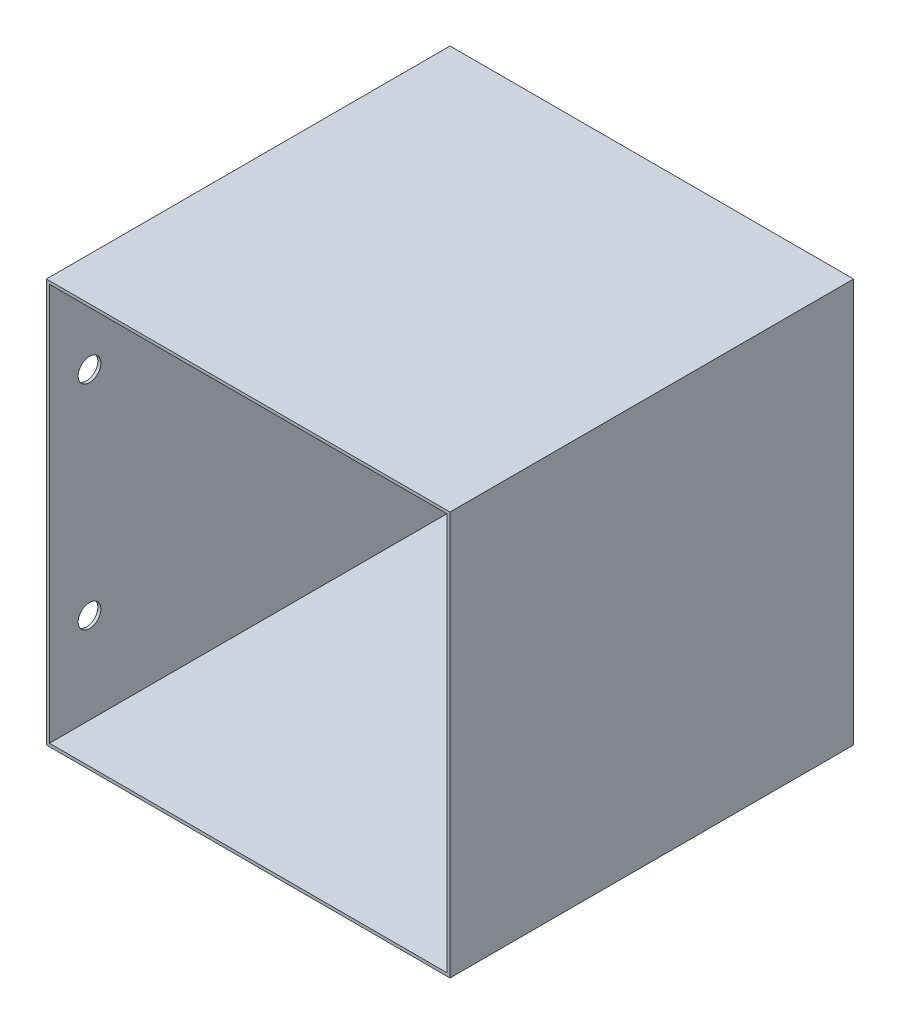
ISO-10303-21;
HEADER;
FILE_DESCRIPTION(('STEP AP214'),'2;1');
FILE_NAME('part.step','',(''),(''),'','','');
FILE_SCHEMA(('AUTOMOTIVE_DESIGN { 1 0 10303 214 1 1 1 1 }'));
ENDSEC;
DATA;
#1=APPLICATION_CONTEXT('core data for automotive mechanical design processes');
#2=APPLICATION_PROTOCOL_DEFINITION('international standard','automotive_design',2000,#1);
#3=PRODUCT_CONTEXT('',#1,'mechanical');
#4=PRODUCT('Part','Part','',(#3));
#5=PRODUCT_RELATED_PRODUCT_CATEGORY('part','',(#4));
#6=PRODUCT_DEFINITION_FORMATION('','',#4);
#7=PRODUCT_DEFINITION_CONTEXT('part definition',#1,'design');
#8=PRODUCT_DEFINITION('design','',#6,#7);
#9=PRODUCT_DEFINITION_SHAPE('','',#8);
#10=(LENGTH_UNIT() NAMED_UNIT(*) SI_UNIT(.MILLI.,.METRE.));
#11=(NAMED_UNIT(*) PLANE_ANGLE_UNIT() SI_UNIT($,.RADIAN.));
#12=(NAMED_UNIT(*) SI_UNIT($,.STERADIAN.) SOLID_ANGLE_UNIT());
#13=UNCERTAINTY_MEASURE_WITH_UNIT(LENGTH_MEASURE(1.E-05),#10,'distance_accuracy_value','');
#14=(GEOMETRIC_REPRESENTATION_CONTEXT(3) GLOBAL_UNCERTAINTY_ASSIGNED_CONTEXT((#13)) GLOBAL_UNIT_ASSIGNED_CONTEXT((#10,
#11,#12)) REPRESENTATION_CONTEXT('',''));
#15=CARTESIAN_POINT('',(0.,0.,0.));
#16=DIRECTION('',(0.,0.,1.));
#17=DIRECTION('',(1.,0.,0.));
#18=AXIS2_PLACEMENT_3D('',#15,#16,#17);
#19=CARTESIAN_POINT('',(0.,0.,80.));
#20=DIRECTION('',(1.,0.,0.));
#21=DIRECTION('',(0.,0.,-1.));
#22=AXIS2_PLACEMENT_3D('',#19,#20,#21);
#23=PLANE('',#22);
#24=CARTESIAN_POINT('',(0.,60.7922841895202,72.0624999999998));
#25=DIRECTION('',(-1.,0.,0.));
#26=DIRECTION('',(0.,0.,1.));
#27=AXIS2_PLACEMENT_3D('',#24,#25,#26);
#28=CIRCLE('',#27,2.24999999999999);
#29=CARTESIAN_POINT('',(0.,60.7922841895202,74.3124999999998));
#30=VERTEX_POINT('',#29);
#31=EDGE_CURVE('E197',#30,#30,#28,.T.);
#32=ORIENTED_EDGE('',*,*,#31,.F.);
#33=EDGE_LOOP('',(#32));
#34=FACE_BOUND('',#33,.T.);
#35=DIRECTION('',(0.,-1.,0.));
#36=VECTOR('',#35,1.);
#37=CARTESIAN_POINT('',(0.,0.,0.));
#38=LINE('',#37,#36);
#39=CARTESIAN_POINT('',(0.,80.,0.));
#40=VERTEX_POINT('',#39);
#41=CARTESIAN_POINT('',(0.,0.,0.));
#42=VERTEX_POINT('',#41);
#43=EDGE_CURVE('E144',#40,#42,#38,.T.);
#44=ORIENTED_EDGE('',*,*,#43,.T.);
#45=DIRECTION('',(0.,0.,-1.));
#46=VECTOR('',#45,1.);
#47=CARTESIAN_POINT('',(0.,0.,80.));
#48=LINE('',#47,#46);
#49=CARTESIAN_POINT('',(0.,0.,80.));
#50=VERTEX_POINT('',#49);
#51=EDGE_CURVE('E11',#50,#42,#48,.T.);
#52=ORIENTED_EDGE('',*,*,#51,.F.);
#53=DIRECTION('',(0.,-1.,0.));
#54=VECTOR('',#53,1.);
#55=CARTESIAN_POINT('',(0.,0.,80.));
#56=LINE('',#55,#54);
#57=CARTESIAN_POINT('',(0.,80.,80.));
#58=VERTEX_POINT('',#57);
#59=EDGE_CURVE('E133',#58,#50,#56,.T.);
#60=ORIENTED_EDGE('',*,*,#59,.F.);
#61=DIRECTION('',(0.,0.,-1.));
#62=VECTOR('',#61,1.);
#63=CARTESIAN_POINT('',(0.,80.,80.));
#64=LINE('',#63,#62);
#65=EDGE_CURVE('E143',#58,#40,#64,.T.);
#66=ORIENTED_EDGE('',*,*,#65,.T.);
#67=EDGE_LOOP('',(#44,#52,#60,#66));
#68=FACE_BOUND('',#67,.T.);
#69=CARTESIAN_POINT('',(0.,18.5518311382399,72.0624999999997));
#70=DIRECTION('',(-1.,0.,0.));
#71=DIRECTION('',(0.,0.,1.));
#72=AXIS2_PLACEMENT_3D('',#69,#70,#71);
#73=CIRCLE('',#72,2.24999999999999);
#74=CARTESIAN_POINT('',(0.,18.5518311382399,74.3124999999997));
#75=VERTEX_POINT('',#74);
#76=EDGE_CURVE('E203',#75,#75,#73,.T.);
#77=ORIENTED_EDGE('',*,*,#76,.F.);
#78=EDGE_LOOP('',(#77));
#79=FACE_BOUND('',#78,.T.);
#80=ADVANCED_FACE('F35',(#34,#68,#79),#23,.F.);
#81=CARTESIAN_POINT('',(0.,0.,80.));
#82=DIRECTION('',(0.,0.,-1.));
#83=DIRECTION('',(-1.,0.,0.));
#84=AXIS2_PLACEMENT_3D('',#81,#82,#83);
#85=PLANE('',#84);
#86=ORIENTED_EDGE('',*,*,#59,.T.);
#87=DIRECTION('',(1.,0.,0.));
#88=VECTOR('',#87,1.);
#89=CARTESIAN_POINT('',(0.,0.,80.));
#90=LINE('',#89,#88);
#91=CARTESIAN_POINT('',(80.,0.,80.));
#92=VERTEX_POINT('',#91);
#93=EDGE_CURVE('E136',#50,#92,#90,.T.);
#94=ORIENTED_EDGE('',*,*,#93,.T.);
#95=DIRECTION('',(0.,1.,0.));
#96=VECTOR('',#95,1.);
#97=CARTESIAN_POINT('',(80.,0.,80.));
#98=LINE('',#97,#96);
#99=CARTESIAN_POINT('',(80.,80.,80.));
#100=VERTEX_POINT('',#99);
#101=EDGE_CURVE('E139',#92,#100,#98,.T.);
#102=ORIENTED_EDGE('',*,*,#101,.T.);
#103=DIRECTION('',(-1.,0.,0.));
#104=VECTOR('',#103,1.);
#105=CARTESIAN_POINT('',(0.,80.,80.));
#106=LINE('',#105,#104);
#107=EDGE_CURVE('E141',#100,#58,#106,.T.);
#108=ORIENTED_EDGE('',*,*,#107,.T.);
#109=EDGE_LOOP('',(#86,#94,#102,#108));
#110=FACE_BOUND('',#109,.T.);
#111=DIRECTION('',(0.,-1.,0.));
#112=VECTOR('',#111,1.);
#113=CARTESIAN_POINT('',(0.6,0.,80.));
#114=LINE('',#113,#112);
#115=CARTESIAN_POINT('',(0.6,79.4,80.));
#116=VERTEX_POINT('',#115);
#117=CARTESIAN_POINT('',(0.6,0.6,80.));
#118=VERTEX_POINT('',#117);
#119=EDGE_CURVE('E121',#116,#118,#114,.T.);
#120=ORIENTED_EDGE('',*,*,#119,.F.);
#121=DIRECTION('',(-1.,0.,0.));
#122=VECTOR('',#121,1.);
#123=CARTESIAN_POINT('',(0.,79.4,80.));
#124=LINE('',#123,#122);
#125=CARTESIAN_POINT('',(79.4,79.4,80.));
#126=VERTEX_POINT('',#125);
#127=EDGE_CURVE('E105',#126,#116,#124,.T.);
#128=ORIENTED_EDGE('',*,*,#127,.F.);
#129=DIRECTION('',(0.,1.,0.));
#130=VECTOR('',#129,1.);
#131=CARTESIAN_POINT('',(79.4,0.,80.));
#132=LINE('',#131,#130);
#133=CARTESIAN_POINT('',(79.4,0.6,80.));
#134=VERTEX_POINT('',#133);
#135=EDGE_CURVE('E130',#134,#126,#132,.T.);
#136=ORIENTED_EDGE('',*,*,#135,.F.);
#137=DIRECTION('',(1.,0.,0.));
#138=VECTOR('',#137,1.);
#139=CARTESIAN_POINT('',(0.,0.6,80.));
#140=LINE('',#139,#138);
#141=EDGE_CURVE('E123',#118,#134,#140,.T.);
#142=ORIENTED_EDGE('',*,*,#141,.F.);
#143=EDGE_LOOP('',(#120,#128,#136,#142));
#144=FACE_BOUND('',#143,.T.);
#145=ADVANCED_FACE('F177',(#110,#144),#85,.F.);
#146=CARTESIAN_POINT('',(0.,0.,0.));
#147=DIRECTION('',(0.,0.,-1.));
#148=DIRECTION('',(-1.,0.,0.));
#149=AXIS2_PLACEMENT_3D('',#146,#147,#148);
#150=PLANE('',#149);
#151=ORIENTED_EDGE('',*,*,#43,.F.);
#152=DIRECTION('',(-1.,0.,0.));
#153=VECTOR('',#152,1.);
#154=CARTESIAN_POINT('',(0.,80.,0.));
#155=LINE('',#154,#153);
#156=CARTESIAN_POINT('',(80.,80.,0.));
#157=VERTEX_POINT('',#156);
#158=EDGE_CURVE('E137',#157,#40,#155,.T.);
#159=ORIENTED_EDGE('',*,*,#158,.F.);
#160=DIRECTION('',(0.,1.,0.));
#161=VECTOR('',#160,1.);
#162=CARTESIAN_POINT('',(80.,0.,0.));
#163=LINE('',#162,#161);
#164=CARTESIAN_POINT('',(80.,0.,0.));
#165=VERTEX_POINT('',#164);
#166=EDGE_CURVE('E149',#165,#157,#163,.T.);
#167=ORIENTED_EDGE('',*,*,#166,.F.);
#168=DIRECTION('',(1.,0.,0.));
#169=VECTOR('',#168,1.);
#170=CARTESIAN_POINT('',(0.,0.,0.));
#171=LINE('',#170,#169);
#172=EDGE_CURVE('E147',#42,#165,#171,.T.);
#173=ORIENTED_EDGE('',*,*,#172,.F.);
#174=EDGE_LOOP('',(#151,#159,#167,#173));
#175=FACE_BOUND('',#174,.T.);
#176=DIRECTION('',(-1.,0.,0.));
#177=VECTOR('',#176,1.);
#178=CARTESIAN_POINT('',(0.,79.4,0.));
#179=LINE('',#178,#177);
#180=CARTESIAN_POINT('',(79.4,79.4,0.));
#181=VERTEX_POINT('',#180);
#182=CARTESIAN_POINT('',(0.6,79.4,0.));
#183=VERTEX_POINT('',#182);
#184=EDGE_CURVE('E103',#181,#183,#179,.T.);
#185=ORIENTED_EDGE('',*,*,#184,.T.);
#186=DIRECTION('',(0.,-1.,0.));
#187=VECTOR('',#186,1.);
#188=CARTESIAN_POINT('',(0.6,0.,0.));
#189=LINE('',#188,#187);
#190=CARTESIAN_POINT('',(0.6,0.6,0.));
#191=VERTEX_POINT('',#190);
#192=EDGE_CURVE('E111',#183,#191,#189,.T.);
#193=ORIENTED_EDGE('',*,*,#192,.T.);
#194=DIRECTION('',(1.,0.,0.));
#195=VECTOR('',#194,1.);
#196=CARTESIAN_POINT('',(0.,0.6,0.));
#197=LINE('',#196,#195);
#198=CARTESIAN_POINT('',(79.4,0.6,0.));
#199=VERTEX_POINT('',#198);
#200=EDGE_CURVE('E117',#191,#199,#197,.T.);
#201=ORIENTED_EDGE('',*,*,#200,.T.);
#202=DIRECTION('',(0.,1.,0.));
#203=VECTOR('',#202,1.);
#204=CARTESIAN_POINT('',(79.4,0.,0.));
#205=LINE('',#204,#203);
#206=EDGE_CURVE('E57',#199,#181,#205,.T.);
#207=ORIENTED_EDGE('',*,*,#206,.T.);
#208=EDGE_LOOP('',(#185,#193,#201,#207));
#209=FACE_BOUND('',#208,.T.);
#210=ADVANCED_FACE('F120',(#175,#209),#150,.T.);
#211=CARTESIAN_POINT('',(0.,0.,80.));
#212=DIRECTION('',(0.,1.,0.));
#213=DIRECTION('',(0.,0.,1.));
#214=AXIS2_PLACEMENT_3D('',#211,#212,#213);
#215=PLANE('',#214);
#216=ORIENTED_EDGE('',*,*,#172,.T.);
#217=DIRECTION('',(0.,0.,-1.));
#218=VECTOR('',#217,1.);
#219=CARTESIAN_POINT('',(80.,0.,80.));
#220=LINE('',#219,#218);
#221=EDGE_CURVE('E43',#92,#165,#220,.T.);
#222=ORIENTED_EDGE('',*,*,#221,.F.);
#223=ORIENTED_EDGE('',*,*,#93,.F.);
#224=ORIENTED_EDGE('',*,*,#51,.T.);
#225=EDGE_LOOP('',(#216,#222,#223,#224));
#226=FACE_BOUND('',#225,.T.);
#227=ADVANCED_FACE('F179',(#226),#215,.F.);
#228=CARTESIAN_POINT('',(80.,0.,80.));
#229=DIRECTION('',(-1.,0.,0.));
#230=DIRECTION('',(0.,0.,1.));
#231=AXIS2_PLACEMENT_3D('',#228,#229,#230);
#232=PLANE('',#231);
#233=ORIENTED_EDGE('',*,*,#166,.T.);
#234=DIRECTION('',(0.,0.,-1.));
#235=VECTOR('',#234,1.);
#236=CARTESIAN_POINT('',(80.,80.,80.));
#237=LINE('',#236,#235);
#238=EDGE_CURVE('E154',#100,#157,#237,.T.);
#239=ORIENTED_EDGE('',*,*,#238,.F.);
#240=ORIENTED_EDGE('',*,*,#101,.F.);
#241=ORIENTED_EDGE('',*,*,#221,.T.);
#242=EDGE_LOOP('',(#233,#239,#240,#241));
#243=FACE_BOUND('',#242,.T.);
#244=ADVANCED_FACE('F162',(#243),#232,.F.);
#245=CARTESIAN_POINT('',(0.,80.,80.));
#246=DIRECTION('',(0.,-1.,0.));
#247=DIRECTION('',(0.,0.,-1.));
#248=AXIS2_PLACEMENT_3D('',#245,#246,#247);
#249=PLANE('',#248);
#250=ORIENTED_EDGE('',*,*,#158,.T.);
#251=ORIENTED_EDGE('',*,*,#65,.F.);
#252=ORIENTED_EDGE('',*,*,#107,.F.);
#253=ORIENTED_EDGE('',*,*,#238,.T.);
#254=EDGE_LOOP('',(#250,#251,#252,#253));
#255=FACE_BOUND('',#254,.T.);
#256=ADVANCED_FACE('F170',(#255),#249,.F.);
#257=CARTESIAN_POINT('',(0.6,0.,80.));
#258=DIRECTION('',(1.,0.,0.));
#259=DIRECTION('',(0.,0.,-1.));
#260=AXIS2_PLACEMENT_3D('',#257,#258,#259);
#261=PLANE('',#260);
#262=CARTESIAN_POINT('',(0.6,18.5518311382399,72.0624999999997));
#263=DIRECTION('',(1.,0.,0.));
#264=DIRECTION('',(0.,0.,-1.));
#265=AXIS2_PLACEMENT_3D('',#262,#263,#264);
#266=CIRCLE('',#265,2.24999999999999);
#267=CARTESIAN_POINT('',(0.6,18.5518311382399,69.8124999999997));
#268=VERTEX_POINT('',#267);
#269=EDGE_CURVE('E38',#268,#268,#266,.T.);
#270=ORIENTED_EDGE('',*,*,#269,.F.);
#271=EDGE_LOOP('',(#270));
#272=FACE_BOUND('',#271,.T.);
#273=CARTESIAN_POINT('',(0.6,60.7922841895202,72.0624999999998));
#274=DIRECTION('',(1.,0.,0.));
#275=DIRECTION('',(0.,0.,-1.));
#276=AXIS2_PLACEMENT_3D('',#273,#274,#275);
#277=CIRCLE('',#276,2.24999999999999);
#278=CARTESIAN_POINT('',(0.6,60.7922841895202,69.8124999999998));
#279=VERTEX_POINT('',#278);
#280=EDGE_CURVE('E118',#279,#279,#277,.T.);
#281=ORIENTED_EDGE('',*,*,#280,.F.);
#282=EDGE_LOOP('',(#281));
#283=FACE_BOUND('',#282,.T.);
#284=ORIENTED_EDGE('',*,*,#192,.F.);
#285=DIRECTION('',(0.,0.,-1.));
#286=VECTOR('',#285,1.);
#287=CARTESIAN_POINT('',(0.6,79.4,80.));
#288=LINE('',#287,#286);
#289=EDGE_CURVE('E99',#116,#183,#288,.T.);
#290=ORIENTED_EDGE('',*,*,#289,.F.);
#291=ORIENTED_EDGE('',*,*,#119,.T.);
#292=DIRECTION('',(0.,0.,-1.));
#293=VECTOR('',#292,1.);
#294=CARTESIAN_POINT('',(0.6,0.6,80.));
#295=LINE('',#294,#293);
#296=EDGE_CURVE('E114',#118,#191,#295,.T.);
#297=ORIENTED_EDGE('',*,*,#296,.T.);
#298=EDGE_LOOP('',(#284,#290,#291,#297));
#299=FACE_BOUND('',#298,.T.);
#300=ADVANCED_FACE('F112',(#272,#283,#299),#261,.T.);
#301=CARTESIAN_POINT('',(0.,0.6,80.));
#302=DIRECTION('',(0.,1.,0.));
#303=DIRECTION('',(0.,0.,1.));
#304=AXIS2_PLACEMENT_3D('',#301,#302,#303);
#305=PLANE('',#304);
#306=ORIENTED_EDGE('',*,*,#200,.F.);
#307=ORIENTED_EDGE('',*,*,#296,.F.);
#308=ORIENTED_EDGE('',*,*,#141,.T.);
#309=DIRECTION('',(0.,0.,-1.));
#310=VECTOR('',#309,1.);
#311=CARTESIAN_POINT('',(79.4,0.6,80.));
#312=LINE('',#311,#310);
#313=EDGE_CURVE('E206',#134,#199,#312,.T.);
#314=ORIENTED_EDGE('',*,*,#313,.T.);
#315=EDGE_LOOP('',(#306,#307,#308,#314));
#316=FACE_BOUND('',#315,.T.);
#317=ADVANCED_FACE('F212',(#316),#305,.T.);
#318=CARTESIAN_POINT('',(79.4,0.,80.));
#319=DIRECTION('',(-1.,0.,0.));
#320=DIRECTION('',(0.,0.,1.));
#321=AXIS2_PLACEMENT_3D('',#318,#319,#320);
#322=PLANE('',#321);
#323=ORIENTED_EDGE('',*,*,#206,.F.);
#324=ORIENTED_EDGE('',*,*,#313,.F.);
#325=ORIENTED_EDGE('',*,*,#135,.T.);
#326=DIRECTION('',(0.,0.,-1.));
#327=VECTOR('',#326,1.);
#328=CARTESIAN_POINT('',(79.4,79.4,80.));
#329=LINE('',#328,#327);
#330=EDGE_CURVE('E50',#126,#181,#329,.T.);
#331=ORIENTED_EDGE('',*,*,#330,.T.);
#332=EDGE_LOOP('',(#323,#324,#325,#331));
#333=FACE_BOUND('',#332,.T.);
#334=ADVANCED_FACE('F208',(#333),#322,.T.);
#335=CARTESIAN_POINT('',(0.,79.4,80.));
#336=DIRECTION('',(0.,-1.,0.));
#337=DIRECTION('',(0.,0.,-1.));
#338=AXIS2_PLACEMENT_3D('',#335,#336,#337);
#339=PLANE('',#338);
#340=ORIENTED_EDGE('',*,*,#184,.F.);
#341=ORIENTED_EDGE('',*,*,#330,.F.);
#342=ORIENTED_EDGE('',*,*,#127,.T.);
#343=ORIENTED_EDGE('',*,*,#289,.T.);
#344=EDGE_LOOP('',(#340,#341,#342,#343));
#345=FACE_BOUND('',#344,.T.);
#346=ADVANCED_FACE('F101',(#345),#339,.T.);
#347=CARTESIAN_POINT('',(0.,60.7922841895202,72.0624999999998));
#348=DIRECTION('',(-1.,0.,0.));
#349=DIRECTION('',(0.,0.,1.));
#350=AXIS2_PLACEMENT_3D('',#347,#348,#349);
#351=CYLINDRICAL_SURFACE('',#350,2.24999999999999);
#352=ORIENTED_EDGE('',*,*,#280,.T.);
#353=EDGE_LOOP('',(#352));
#354=FACE_BOUND('',#353,.T.);
#355=ORIENTED_EDGE('',*,*,#31,.T.);
#356=EDGE_LOOP('',(#355));
#357=FACE_BOUND('',#356,.T.);
#358=ADVANCED_FACE('F225',(#354,#357),#351,.F.);
#359=CARTESIAN_POINT('',(0.,18.5518311382399,72.0624999999997));
#360=DIRECTION('',(-1.,0.,0.));
#361=DIRECTION('',(0.,0.,1.));
#362=AXIS2_PLACEMENT_3D('',#359,#360,#361);
#363=CYLINDRICAL_SURFACE('',#362,2.24999999999999);
#364=ORIENTED_EDGE('',*,*,#269,.T.);
#365=EDGE_LOOP('',(#364));
#366=FACE_BOUND('',#365,.T.);
#367=ORIENTED_EDGE('',*,*,#76,.T.);
#368=EDGE_LOOP('',(#367));
#369=FACE_BOUND('',#368,.T.);
#370=ADVANCED_FACE('F247',(#366,#369),#363,.F.);
#371=CLOSED_SHELL('',(#80,#145,#210,#227,#244,#256,#300,#317,#334,#346,#358,#370));
#372=MANIFOLD_SOLID_BREP('B2',#371);
#373=ADVANCED_BREP_SHAPE_REPRESENTATION('',(#18,#372),#14);
#374=SHAPE_DEFINITION_REPRESENTATION(#9,#373);
ENDSEC;
END-ISO-10303-21;
